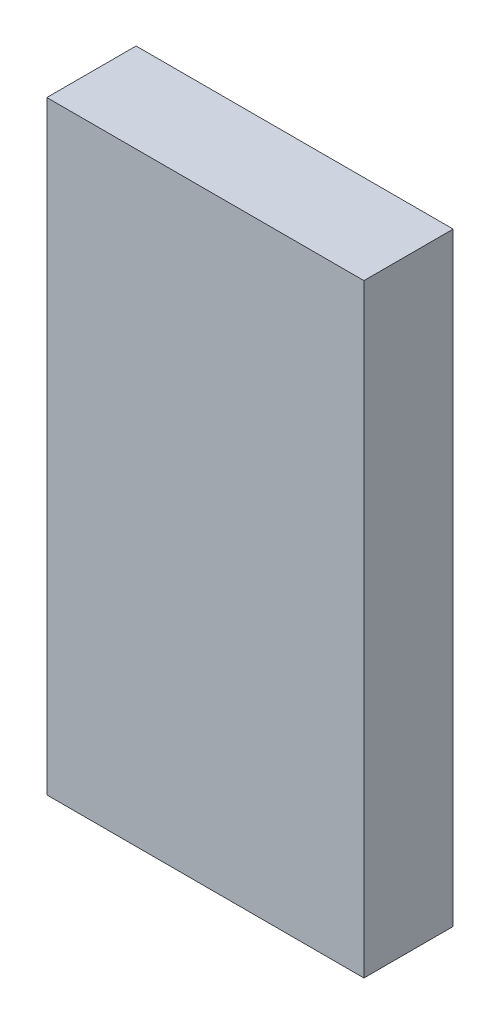
ISO-10303-21;
HEADER;
FILE_DESCRIPTION(('STEP AP214'),'2;1');
FILE_NAME('part.step','',(''),(''),'','','');
FILE_SCHEMA(('AUTOMOTIVE_DESIGN { 1 0 10303 214 1 1 1 1 }'));
ENDSEC;
DATA;
#1=APPLICATION_CONTEXT('core data for automotive mechanical design processes');
#2=APPLICATION_PROTOCOL_DEFINITION('international standard','automotive_design',2000,#1);
#3=PRODUCT_CONTEXT('',#1,'mechanical');
#4=PRODUCT('Part','Part','',(#3));
#5=PRODUCT_RELATED_PRODUCT_CATEGORY('part','',(#4));
#6=PRODUCT_DEFINITION_FORMATION('','',#4);
#7=PRODUCT_DEFINITION_CONTEXT('part definition',#1,'design');
#8=PRODUCT_DEFINITION('design','',#6,#7);
#9=PRODUCT_DEFINITION_SHAPE('','',#8);
#10=(LENGTH_UNIT() NAMED_UNIT(*) SI_UNIT(.MILLI.,.METRE.));
#11=(NAMED_UNIT(*) PLANE_ANGLE_UNIT() SI_UNIT($,.RADIAN.));
#12=(NAMED_UNIT(*) SI_UNIT($,.STERADIAN.) SOLID_ANGLE_UNIT());
#13=UNCERTAINTY_MEASURE_WITH_UNIT(LENGTH_MEASURE(1.E-05),#10,'distance_accuracy_value','');
#14=(GEOMETRIC_REPRESENTATION_CONTEXT(3) GLOBAL_UNCERTAINTY_ASSIGNED_CONTEXT((#13)) GLOBAL_UNIT_ASSIGNED_CONTEXT((#10,
#11,#12)) REPRESENTATION_CONTEXT('',''));
#15=CARTESIAN_POINT('',(0.,0.,0.));
#16=DIRECTION('',(0.,0.,1.));
#17=DIRECTION('',(1.,0.,0.));
#18=AXIS2_PLACEMENT_3D('',#15,#16,#17);
#19=CARTESIAN_POINT('',(0.,0.,15.));
#20=DIRECTION('',(1.,0.,0.));
#21=DIRECTION('',(0.,0.,-1.));
#22=AXIS2_PLACEMENT_3D('',#19,#20,#21);
#23=PLANE('',#22);
#24=DIRECTION('',(0.,-1.,0.));
#25=VECTOR('',#24,1.);
#26=CARTESIAN_POINT('',(0.,0.,0.));
#27=LINE('',#26,#25);
#28=CARTESIAN_POINT('',(0.,101.52,0.));
#29=VERTEX_POINT('',#28);
#30=CARTESIAN_POINT('',(0.,0.,0.));
#31=VERTEX_POINT('',#30);
#32=EDGE_CURVE('E107',#29,#31,#27,.T.);
#33=ORIENTED_EDGE('',*,*,#32,.T.);
#34=DIRECTION('',(0.,0.,-1.));
#35=VECTOR('',#34,1.);
#36=CARTESIAN_POINT('',(0.,0.,15.));
#37=LINE('',#36,#35);
#38=CARTESIAN_POINT('',(0.,0.,15.));
#39=VERTEX_POINT('',#38);
#40=EDGE_CURVE('E11',#39,#31,#37,.T.);
#41=ORIENTED_EDGE('',*,*,#40,.F.);
#42=DIRECTION('',(0.,-1.,0.));
#43=VECTOR('',#42,1.);
#44=CARTESIAN_POINT('',(0.,0.,15.));
#45=LINE('',#44,#43);
#46=CARTESIAN_POINT('',(0.,101.52,15.));
#47=VERTEX_POINT('',#46);
#48=EDGE_CURVE('E91',#47,#39,#45,.T.);
#49=ORIENTED_EDGE('',*,*,#48,.F.);
#50=DIRECTION('',(0.,0.,-1.));
#51=VECTOR('',#50,1.);
#52=CARTESIAN_POINT('',(0.,101.52,15.));
#53=LINE('',#52,#51);
#54=EDGE_CURVE('E103',#47,#29,#53,.T.);
#55=ORIENTED_EDGE('',*,*,#54,.T.);
#56=EDGE_LOOP('',(#33,#41,#49,#55));
#57=FACE_BOUND('',#56,.T.);
#58=ADVANCED_FACE('F39',(#57),#23,.F.);
#59=CARTESIAN_POINT('',(0.,0.,15.));
#60=DIRECTION('',(0.,1.,0.));
#61=DIRECTION('',(0.,0.,1.));
#62=AXIS2_PLACEMENT_3D('',#59,#60,#61);
#63=PLANE('',#62);
#64=DIRECTION('',(1.,0.,0.));
#65=VECTOR('',#64,1.);
#66=CARTESIAN_POINT('',(0.,0.,0.));
#67=LINE('',#66,#65);
#68=CARTESIAN_POINT('',(53.3,0.,0.));
#69=VERTEX_POINT('',#68);
#70=EDGE_CURVE('E96',#31,#69,#67,.T.);
#71=ORIENTED_EDGE('',*,*,#70,.T.);
#72=DIRECTION('',(0.,0.,-1.));
#73=VECTOR('',#72,1.);
#74=CARTESIAN_POINT('',(53.3,0.,15.));
#75=LINE('',#74,#73);
#76=CARTESIAN_POINT('',(53.3,0.,15.));
#77=VERTEX_POINT('',#76);
#78=EDGE_CURVE('E48',#77,#69,#75,.T.);
#79=ORIENTED_EDGE('',*,*,#78,.F.);
#80=DIRECTION('',(1.,0.,0.));
#81=VECTOR('',#80,1.);
#82=CARTESIAN_POINT('',(0.,0.,15.));
#83=LINE('',#82,#81);
#84=EDGE_CURVE('E86',#39,#77,#83,.T.);
#85=ORIENTED_EDGE('',*,*,#84,.F.);
#86=ORIENTED_EDGE('',*,*,#40,.T.);
#87=EDGE_LOOP('',(#71,#79,#85,#86));
#88=FACE_BOUND('',#87,.T.);
#89=ADVANCED_FACE('F95',(#88),#63,.F.);
#90=CARTESIAN_POINT('',(53.3,0.,15.));
#91=DIRECTION('',(-1.,0.,0.));
#92=DIRECTION('',(0.,0.,1.));
#93=AXIS2_PLACEMENT_3D('',#90,#91,#92);
#94=PLANE('',#93);
#95=DIRECTION('',(0.,1.,0.));
#96=VECTOR('',#95,1.);
#97=CARTESIAN_POINT('',(53.3,0.,0.));
#98=LINE('',#97,#96);
#99=CARTESIAN_POINT('',(53.3,101.52,0.));
#100=VERTEX_POINT('',#99);
#101=EDGE_CURVE('E73',#69,#100,#98,.T.);
#102=ORIENTED_EDGE('',*,*,#101,.T.);
#103=DIRECTION('',(0.,0.,-1.));
#104=VECTOR('',#103,1.);
#105=CARTESIAN_POINT('',(53.3,101.52,15.));
#106=LINE('',#105,#104);
#107=CARTESIAN_POINT('',(53.3,101.52,15.));
#108=VERTEX_POINT('',#107);
#109=EDGE_CURVE('E98',#108,#100,#106,.T.);
#110=ORIENTED_EDGE('',*,*,#109,.F.);
#111=DIRECTION('',(0.,1.,0.));
#112=VECTOR('',#111,1.);
#113=CARTESIAN_POINT('',(53.3,0.,15.));
#114=LINE('',#113,#112);
#115=EDGE_CURVE('E89',#77,#108,#114,.T.);
#116=ORIENTED_EDGE('',*,*,#115,.F.);
#117=ORIENTED_EDGE('',*,*,#78,.T.);
#118=EDGE_LOOP('',(#102,#110,#116,#117));
#119=FACE_BOUND('',#118,.T.);
#120=ADVANCED_FACE('F99',(#119),#94,.F.);
#121=CARTESIAN_POINT('',(0.,101.52,15.));
#122=DIRECTION('',(0.,-1.,0.));
#123=DIRECTION('',(0.,0.,-1.));
#124=AXIS2_PLACEMENT_3D('',#121,#122,#123);
#125=PLANE('',#124);
#126=DIRECTION('',(-1.,0.,0.));
#127=VECTOR('',#126,1.);
#128=CARTESIAN_POINT('',(0.,101.52,0.));
#129=LINE('',#128,#127);
#130=EDGE_CURVE('E79',#100,#29,#129,.T.);
#131=ORIENTED_EDGE('',*,*,#130,.T.);
#132=ORIENTED_EDGE('',*,*,#54,.F.);
#133=DIRECTION('',(-1.,0.,0.));
#134=VECTOR('',#133,1.);
#135=CARTESIAN_POINT('',(0.,101.52,15.));
#136=LINE('',#135,#134);
#137=EDGE_CURVE('E56',#108,#47,#136,.T.);
#138=ORIENTED_EDGE('',*,*,#137,.F.);
#139=ORIENTED_EDGE('',*,*,#109,.T.);
#140=EDGE_LOOP('',(#131,#132,#138,#139));
#141=FACE_BOUND('',#140,.T.);
#142=ADVANCED_FACE('F120',(#141),#125,.F.);
#143=CARTESIAN_POINT('',(0.,0.,15.));
#144=DIRECTION('',(0.,0.,-1.));
#145=DIRECTION('',(-1.,0.,0.));
#146=AXIS2_PLACEMENT_3D('',#143,#144,#145);
#147=PLANE('',#146);
#148=ORIENTED_EDGE('',*,*,#48,.T.);
#149=ORIENTED_EDGE('',*,*,#84,.T.);
#150=ORIENTED_EDGE('',*,*,#115,.T.);
#151=ORIENTED_EDGE('',*,*,#137,.T.);
#152=EDGE_LOOP('',(#148,#149,#150,#151));
#153=FACE_BOUND('',#152,.T.);
#154=ADVANCED_FACE('F87',(#153),#147,.F.);
#155=CARTESIAN_POINT('',(0.,0.,0.));
#156=DIRECTION('',(0.,0.,-1.));
#157=DIRECTION('',(-1.,0.,0.));
#158=AXIS2_PLACEMENT_3D('',#155,#156,#157);
#159=PLANE('',#158);
#160=ORIENTED_EDGE('',*,*,#32,.F.);
#161=ORIENTED_EDGE('',*,*,#130,.F.);
#162=ORIENTED_EDGE('',*,*,#101,.F.);
#163=ORIENTED_EDGE('',*,*,#70,.F.);
#164=EDGE_LOOP('',(#160,#161,#162,#163));
#165=FACE_BOUND('',#164,.T.);
#166=ADVANCED_FACE('F123',(#165),#159,.T.);
#167=CLOSED_SHELL('',(#58,#89,#120,#142,#154,#166));
#168=MANIFOLD_SOLID_BREP('B2',#167);
#169=ADVANCED_BREP_SHAPE_REPRESENTATION('',(#18,#168),#14);
#170=SHAPE_DEFINITION_REPRESENTATION(#9,#169);
ENDSEC;
END-ISO-10303-21;
